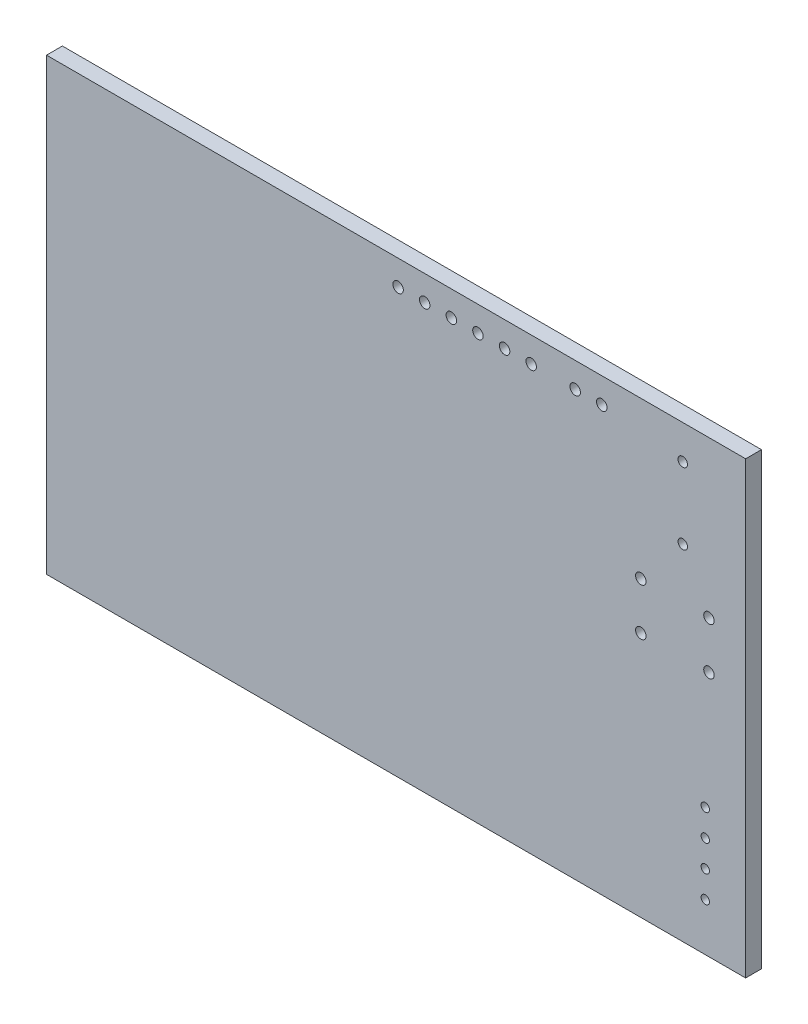
ISO-10303-21;
HEADER;
FILE_DESCRIPTION(('STEP AP214'),'2;1');
FILE_NAME('part.step','',(''),(''),'','','');
FILE_SCHEMA(('AUTOMOTIVE_DESIGN { 1 0 10303 214 1 1 1 1 }'));
ENDSEC;
DATA;
#1=APPLICATION_CONTEXT('core data for automotive mechanical design processes');
#2=APPLICATION_PROTOCOL_DEFINITION('international standard','automotive_design',2000,#1);
#3=PRODUCT_CONTEXT('',#1,'mechanical');
#4=PRODUCT('Part','Part','',(#3));
#5=PRODUCT_RELATED_PRODUCT_CATEGORY('part','',(#4));
#6=PRODUCT_DEFINITION_FORMATION('','',#4);
#7=PRODUCT_DEFINITION_CONTEXT('part definition',#1,'design');
#8=PRODUCT_DEFINITION('design','',#6,#7);
#9=PRODUCT_DEFINITION_SHAPE('','',#8);
#10=(LENGTH_UNIT() NAMED_UNIT(*) SI_UNIT(.MILLI.,.METRE.));
#11=(NAMED_UNIT(*) PLANE_ANGLE_UNIT() SI_UNIT($,.RADIAN.));
#12=(NAMED_UNIT(*) SI_UNIT($,.STERADIAN.) SOLID_ANGLE_UNIT());
#13=UNCERTAINTY_MEASURE_WITH_UNIT(LENGTH_MEASURE(1.E-05),#10,'distance_accuracy_value','');
#14=(GEOMETRIC_REPRESENTATION_CONTEXT(3) GLOBAL_UNCERTAINTY_ASSIGNED_CONTEXT((#13)) GLOBAL_UNIT_ASSIGNED_CONTEXT((#10,
#11,#12)) REPRESENTATION_CONTEXT('',''));
#15=CARTESIAN_POINT('',(0.,0.,0.));
#16=DIRECTION('',(0.,0.,1.));
#17=DIRECTION('',(1.,0.,0.));
#18=AXIS2_PLACEMENT_3D('',#15,#16,#17);
#19=CARTESIAN_POINT('',(27.35,18.2,-0.046));
#20=DIRECTION('',(0.,0.,-1.));
#21=DIRECTION('',(0.,-1.,0.));
#22=AXIS2_PLACEMENT_3D('',#19,#20,#21);
#23=CYLINDRICAL_SURFACE('',#22,0.45);
#24=CARTESIAN_POINT('',(27.35,18.2,1.510198));
#25=DIRECTION('',(0.,0.,-1.));
#26=DIRECTION('',(0.,-1.,0.));
#27=AXIS2_PLACEMENT_3D('',#24,#25,#26);
#28=CIRCLE('',#27,0.45);
#29=CARTESIAN_POINT('',(27.35,17.75,1.510198));
#30=VERTEX_POINT('',#29);
#31=EDGE_CURVE('E10',#30,#30,#28,.T.);
#32=ORIENTED_EDGE('',*,*,#31,.F.);
#33=EDGE_LOOP('',(#32));
#34=FACE_BOUND('',#33,.T.);
#35=CARTESIAN_POINT('',(27.35,18.2,0.));
#36=DIRECTION('',(0.,0.,-1.));
#37=DIRECTION('',(0.,-1.,0.));
#38=AXIS2_PLACEMENT_3D('',#35,#36,#37);
#39=CIRCLE('',#38,0.45);
#40=CARTESIAN_POINT('',(27.35,17.75,0.));
#41=VERTEX_POINT('',#40);
#42=EDGE_CURVE('E167',#41,#41,#39,.T.);
#43=ORIENTED_EDGE('',*,*,#42,.T.);
#44=EDGE_LOOP('',(#43));
#45=FACE_BOUND('',#44,.T.);
#46=ADVANCED_FACE('F16',(#34,#45),#23,.F.);
#47=CARTESIAN_POINT('',(27.35,11.4,-0.046));
#48=DIRECTION('',(0.,0.,-1.));
#49=DIRECTION('',(0.,-1.,0.));
#50=AXIS2_PLACEMENT_3D('',#47,#48,#49);
#51=CYLINDRICAL_SURFACE('',#50,0.45);
#52=CARTESIAN_POINT('',(27.35,11.4,1.510198));
#53=DIRECTION('',(0.,0.,-1.));
#54=DIRECTION('',(0.,-1.,0.));
#55=AXIS2_PLACEMENT_3D('',#52,#53,#54);
#56=CIRCLE('',#55,0.45);
#57=CARTESIAN_POINT('',(27.35,10.95,1.510198));
#58=VERTEX_POINT('',#57);
#59=EDGE_CURVE('E19',#58,#58,#56,.T.);
#60=ORIENTED_EDGE('',*,*,#59,.F.);
#61=EDGE_LOOP('',(#60));
#62=FACE_BOUND('',#61,.T.);
#63=CARTESIAN_POINT('',(27.35,11.4,0.));
#64=DIRECTION('',(0.,0.,-1.));
#65=DIRECTION('',(0.,-1.,0.));
#66=AXIS2_PLACEMENT_3D('',#63,#64,#65);
#67=CIRCLE('',#66,0.45);
#68=CARTESIAN_POINT('',(27.35,10.95,0.));
#69=VERTEX_POINT('',#68);
#70=EDGE_CURVE('E171',#69,#69,#67,.T.);
#71=ORIENTED_EDGE('',*,*,#70,.T.);
#72=EDGE_LOOP('',(#71));
#73=FACE_BOUND('',#72,.T.);
#74=ADVANCED_FACE('F242',(#62,#73),#51,.F.);
#75=CARTESIAN_POINT('',(19.625,19.05,-0.046));
#76=DIRECTION('',(0.,0.,-1.));
#77=DIRECTION('',(0.,-1.,0.));
#78=AXIS2_PLACEMENT_3D('',#75,#76,#77);
#79=CYLINDRICAL_SURFACE('',#78,0.5);
#80=CARTESIAN_POINT('',(19.625,19.05,1.510198));
#81=DIRECTION('',(0.,0.,-1.));
#82=DIRECTION('',(0.,-1.,0.));
#83=AXIS2_PLACEMENT_3D('',#80,#81,#82);
#84=CIRCLE('',#83,0.5);
#85=CARTESIAN_POINT('',(19.625,18.55,1.510198));
#86=VERTEX_POINT('',#85);
#87=EDGE_CURVE('E125',#86,#86,#84,.T.);
#88=ORIENTED_EDGE('',*,*,#87,.F.);
#89=EDGE_LOOP('',(#88));
#90=FACE_BOUND('',#89,.T.);
#91=CARTESIAN_POINT('',(19.625,19.05,0.));
#92=DIRECTION('',(0.,0.,-1.));
#93=DIRECTION('',(0.,-1.,0.));
#94=AXIS2_PLACEMENT_3D('',#91,#92,#93);
#95=CIRCLE('',#94,0.5);
#96=CARTESIAN_POINT('',(19.625,18.55,0.));
#97=VERTEX_POINT('',#96);
#98=EDGE_CURVE('E166',#97,#97,#95,.T.);
#99=ORIENTED_EDGE('',*,*,#98,.T.);
#100=EDGE_LOOP('',(#99));
#101=FACE_BOUND('',#100,.T.);
#102=ADVANCED_FACE('F245',(#90,#101),#79,.F.);
#103=CARTESIAN_POINT('',(17.085,19.05,-0.046));
#104=DIRECTION('',(0.,0.,-1.));
#105=DIRECTION('',(0.,-1.,0.));
#106=AXIS2_PLACEMENT_3D('',#103,#104,#105);
#107=CYLINDRICAL_SURFACE('',#106,0.5);
#108=CARTESIAN_POINT('',(17.085,19.05,1.510198));
#109=DIRECTION('',(0.,0.,-1.));
#110=DIRECTION('',(0.,-1.,0.));
#111=AXIS2_PLACEMENT_3D('',#108,#109,#110);
#112=CIRCLE('',#111,0.5);
#113=CARTESIAN_POINT('',(17.085,18.55,1.510198));
#114=VERTEX_POINT('',#113);
#115=EDGE_CURVE('E122',#114,#114,#112,.T.);
#116=ORIENTED_EDGE('',*,*,#115,.F.);
#117=EDGE_LOOP('',(#116));
#118=FACE_BOUND('',#117,.T.);
#119=CARTESIAN_POINT('',(17.085,19.05,0.));
#120=DIRECTION('',(0.,0.,-1.));
#121=DIRECTION('',(0.,-1.,0.));
#122=AXIS2_PLACEMENT_3D('',#119,#120,#121);
#123=CIRCLE('',#122,0.5);
#124=CARTESIAN_POINT('',(17.085,18.55,0.));
#125=VERTEX_POINT('',#124);
#126=EDGE_CURVE('E161',#125,#125,#123,.T.);
#127=ORIENTED_EDGE('',*,*,#126,.T.);
#128=EDGE_LOOP('',(#127));
#129=FACE_BOUND('',#128,.T.);
#130=ADVANCED_FACE('F403',(#118,#129),#107,.F.);
#131=CARTESIAN_POINT('',(29.85,6.55,-0.046));
#132=DIRECTION('',(0.,0.,-1.));
#133=DIRECTION('',(0.,-1.,0.));
#134=AXIS2_PLACEMENT_3D('',#131,#132,#133);
#135=CYLINDRICAL_SURFACE('',#134,0.5);
#136=CARTESIAN_POINT('',(29.85,6.55,1.510198));
#137=DIRECTION('',(0.,0.,-1.));
#138=DIRECTION('',(0.,-1.,0.));
#139=AXIS2_PLACEMENT_3D('',#136,#137,#138);
#140=CIRCLE('',#139,0.5);
#141=CARTESIAN_POINT('',(29.85,6.05,1.510198));
#142=VERTEX_POINT('',#141);
#143=EDGE_CURVE('E126',#142,#142,#140,.T.);
#144=ORIENTED_EDGE('',*,*,#143,.F.);
#145=EDGE_LOOP('',(#144));
#146=FACE_BOUND('',#145,.T.);
#147=CARTESIAN_POINT('',(29.85,6.55,0.));
#148=DIRECTION('',(0.,0.,-1.));
#149=DIRECTION('',(0.,-1.,0.));
#150=AXIS2_PLACEMENT_3D('',#147,#148,#149);
#151=CIRCLE('',#150,0.5);
#152=CARTESIAN_POINT('',(29.85,6.05,0.));
#153=VERTEX_POINT('',#152);
#154=EDGE_CURVE('E158',#153,#153,#151,.T.);
#155=ORIENTED_EDGE('',*,*,#154,.T.);
#156=EDGE_LOOP('',(#155));
#157=FACE_BOUND('',#156,.T.);
#158=ADVANCED_FACE('F399',(#146,#157),#135,.F.);
#159=CARTESIAN_POINT('',(23.35,6.55,-0.046));
#160=DIRECTION('',(0.,0.,-1.));
#161=DIRECTION('',(0.,-1.,0.));
#162=AXIS2_PLACEMENT_3D('',#159,#160,#161);
#163=CYLINDRICAL_SURFACE('',#162,0.5);
#164=CARTESIAN_POINT('',(23.35,6.55,1.510198));
#165=DIRECTION('',(0.,0.,-1.));
#166=DIRECTION('',(0.,-1.,0.));
#167=AXIS2_PLACEMENT_3D('',#164,#165,#166);
#168=CIRCLE('',#167,0.5);
#169=CARTESIAN_POINT('',(23.35,6.05,1.510198));
#170=VERTEX_POINT('',#169);
#171=EDGE_CURVE('E186',#170,#170,#168,.T.);
#172=ORIENTED_EDGE('',*,*,#171,.F.);
#173=EDGE_LOOP('',(#172));
#174=FACE_BOUND('',#173,.T.);
#175=CARTESIAN_POINT('',(23.35,6.55,0.));
#176=DIRECTION('',(0.,0.,-1.));
#177=DIRECTION('',(0.,-1.,0.));
#178=AXIS2_PLACEMENT_3D('',#175,#176,#177);
#179=CIRCLE('',#178,0.5);
#180=CARTESIAN_POINT('',(23.35,6.05,0.));
#181=VERTEX_POINT('',#180);
#182=EDGE_CURVE('E118',#181,#181,#179,.T.);
#183=ORIENTED_EDGE('',*,*,#182,.T.);
#184=EDGE_LOOP('',(#183));
#185=FACE_BOUND('',#184,.T.);
#186=ADVANCED_FACE('F331',(#174,#185),#163,.F.);
#187=CARTESIAN_POINT('',(29.85,2.05,-0.046));
#188=DIRECTION('',(0.,0.,-1.));
#189=DIRECTION('',(0.,-1.,0.));
#190=AXIS2_PLACEMENT_3D('',#187,#188,#189);
#191=CYLINDRICAL_SURFACE('',#190,0.5);
#192=CARTESIAN_POINT('',(29.85,2.05,1.510198));
#193=DIRECTION('',(0.,0.,-1.));
#194=DIRECTION('',(0.,-1.,0.));
#195=AXIS2_PLACEMENT_3D('',#192,#193,#194);
#196=CIRCLE('',#195,0.5);
#197=CARTESIAN_POINT('',(29.85,1.55,1.510198));
#198=VERTEX_POINT('',#197);
#199=EDGE_CURVE('E224',#198,#198,#196,.T.);
#200=ORIENTED_EDGE('',*,*,#199,.F.);
#201=EDGE_LOOP('',(#200));
#202=FACE_BOUND('',#201,.T.);
#203=CARTESIAN_POINT('',(29.85,2.05,0.));
#204=DIRECTION('',(0.,0.,-1.));
#205=DIRECTION('',(0.,-1.,0.));
#206=AXIS2_PLACEMENT_3D('',#203,#204,#205);
#207=CIRCLE('',#206,0.5);
#208=CARTESIAN_POINT('',(29.85,1.55,0.));
#209=VERTEX_POINT('',#208);
#210=EDGE_CURVE('E114',#209,#209,#207,.T.);
#211=ORIENTED_EDGE('',*,*,#210,.T.);
#212=EDGE_LOOP('',(#211));
#213=FACE_BOUND('',#212,.T.);
#214=ADVANCED_FACE('F328',(#202,#213),#191,.F.);
#215=CARTESIAN_POINT('',(23.35,2.05,-0.046));
#216=DIRECTION('',(0.,0.,-1.));
#217=DIRECTION('',(0.,-1.,0.));
#218=AXIS2_PLACEMENT_3D('',#215,#216,#217);
#219=CYLINDRICAL_SURFACE('',#218,0.5);
#220=CARTESIAN_POINT('',(23.35,2.05,1.510198));
#221=DIRECTION('',(0.,0.,-1.));
#222=DIRECTION('',(0.,-1.,0.));
#223=AXIS2_PLACEMENT_3D('',#220,#221,#222);
#224=CIRCLE('',#223,0.5);
#225=CARTESIAN_POINT('',(23.35,1.55,1.510198));
#226=VERTEX_POINT('',#225);
#227=EDGE_CURVE('E220',#226,#226,#224,.T.);
#228=ORIENTED_EDGE('',*,*,#227,.F.);
#229=EDGE_LOOP('',(#228));
#230=FACE_BOUND('',#229,.T.);
#231=CARTESIAN_POINT('',(23.35,2.05,0.));
#232=DIRECTION('',(0.,0.,-1.));
#233=DIRECTION('',(0.,-1.,0.));
#234=AXIS2_PLACEMENT_3D('',#231,#232,#233);
#235=CIRCLE('',#234,0.5);
#236=CARTESIAN_POINT('',(23.35,1.55,0.));
#237=VERTEX_POINT('',#236);
#238=EDGE_CURVE('E119',#237,#237,#235,.T.);
#239=ORIENTED_EDGE('',*,*,#238,.T.);
#240=EDGE_LOOP('',(#239));
#241=FACE_BOUND('',#240,.T.);
#242=ADVANCED_FACE('F330',(#230,#241),#219,.F.);
#243=CARTESIAN_POINT('',(12.89,19.05,-0.046));
#244=DIRECTION('',(0.,0.,-1.));
#245=DIRECTION('',(0.,-1.,0.));
#246=AXIS2_PLACEMENT_3D('',#243,#244,#245);
#247=CYLINDRICAL_SURFACE('',#246,0.5);
#248=CARTESIAN_POINT('',(12.89,19.05,1.510198));
#249=DIRECTION('',(0.,0.,-1.));
#250=DIRECTION('',(0.,-1.,0.));
#251=AXIS2_PLACEMENT_3D('',#248,#249,#250);
#252=CIRCLE('',#251,0.5);
#253=CARTESIAN_POINT('',(12.89,18.55,1.510198));
#254=VERTEX_POINT('',#253);
#255=EDGE_CURVE('E216',#254,#254,#252,.T.);
#256=ORIENTED_EDGE('',*,*,#255,.F.);
#257=EDGE_LOOP('',(#256));
#258=FACE_BOUND('',#257,.T.);
#259=CARTESIAN_POINT('',(12.89,19.05,0.));
#260=DIRECTION('',(0.,0.,-1.));
#261=DIRECTION('',(0.,-1.,0.));
#262=AXIS2_PLACEMENT_3D('',#259,#260,#261);
#263=CIRCLE('',#262,0.5);
#264=CARTESIAN_POINT('',(12.89,18.55,0.));
#265=VERTEX_POINT('',#264);
#266=EDGE_CURVE('E154',#265,#265,#263,.T.);
#267=ORIENTED_EDGE('',*,*,#266,.T.);
#268=EDGE_LOOP('',(#267));
#269=FACE_BOUND('',#268,.T.);
#270=ADVANCED_FACE('F345',(#258,#269),#247,.F.);
#271=CARTESIAN_POINT('',(10.35,19.05,-0.046));
#272=DIRECTION('',(0.,0.,-1.));
#273=DIRECTION('',(0.,-1.,0.));
#274=AXIS2_PLACEMENT_3D('',#271,#272,#273);
#275=CYLINDRICAL_SURFACE('',#274,0.5);
#276=CARTESIAN_POINT('',(10.35,19.05,1.510198));
#277=DIRECTION('',(0.,0.,-1.));
#278=DIRECTION('',(0.,-1.,0.));
#279=AXIS2_PLACEMENT_3D('',#276,#277,#278);
#280=CIRCLE('',#279,0.5);
#281=CARTESIAN_POINT('',(10.35,18.55,1.510198));
#282=VERTEX_POINT('',#281);
#283=EDGE_CURVE('E212',#282,#282,#280,.T.);
#284=ORIENTED_EDGE('',*,*,#283,.F.);
#285=EDGE_LOOP('',(#284));
#286=FACE_BOUND('',#285,.T.);
#287=CARTESIAN_POINT('',(10.35,19.05,0.));
#288=DIRECTION('',(0.,0.,-1.));
#289=DIRECTION('',(0.,-1.,0.));
#290=AXIS2_PLACEMENT_3D('',#287,#288,#289);
#291=CIRCLE('',#290,0.5);
#292=CARTESIAN_POINT('',(10.35,18.55,0.));
#293=VERTEX_POINT('',#292);
#294=EDGE_CURVE('E150',#293,#293,#291,.T.);
#295=ORIENTED_EDGE('',*,*,#294,.T.);
#296=EDGE_LOOP('',(#295));
#297=FACE_BOUND('',#296,.T.);
#298=ADVANCED_FACE('F336',(#286,#297),#275,.F.);
#299=CARTESIAN_POINT('',(7.81,19.05,-0.046));
#300=DIRECTION('',(0.,0.,-1.));
#301=DIRECTION('',(0.,-1.,0.));
#302=AXIS2_PLACEMENT_3D('',#299,#300,#301);
#303=CYLINDRICAL_SURFACE('',#302,0.5);
#304=CARTESIAN_POINT('',(7.81,19.05,1.510198));
#305=DIRECTION('',(0.,0.,-1.));
#306=DIRECTION('',(0.,-1.,0.));
#307=AXIS2_PLACEMENT_3D('',#304,#305,#306);
#308=CIRCLE('',#307,0.5);
#309=CARTESIAN_POINT('',(7.81,18.55,1.510198));
#310=VERTEX_POINT('',#309);
#311=EDGE_CURVE('E208',#310,#310,#308,.T.);
#312=ORIENTED_EDGE('',*,*,#311,.F.);
#313=EDGE_LOOP('',(#312));
#314=FACE_BOUND('',#313,.T.);
#315=CARTESIAN_POINT('',(7.81,19.05,0.));
#316=DIRECTION('',(0.,0.,-1.));
#317=DIRECTION('',(0.,-1.,0.));
#318=AXIS2_PLACEMENT_3D('',#315,#316,#317);
#319=CIRCLE('',#318,0.5);
#320=CARTESIAN_POINT('',(7.81,18.55,0.));
#321=VERTEX_POINT('',#320);
#322=EDGE_CURVE('E146',#321,#321,#319,.T.);
#323=ORIENTED_EDGE('',*,*,#322,.T.);
#324=EDGE_LOOP('',(#323));
#325=FACE_BOUND('',#324,.T.);
#326=ADVANCED_FACE('F333',(#314,#325),#303,.F.);
#327=CARTESIAN_POINT('',(5.27,19.05,-0.046));
#328=DIRECTION('',(0.,0.,-1.));
#329=DIRECTION('',(0.,-1.,0.));
#330=AXIS2_PLACEMENT_3D('',#327,#328,#329);
#331=CYLINDRICAL_SURFACE('',#330,0.5);
#332=CARTESIAN_POINT('',(5.27,19.05,1.510198));
#333=DIRECTION('',(0.,0.,-1.));
#334=DIRECTION('',(0.,-1.,0.));
#335=AXIS2_PLACEMENT_3D('',#332,#333,#334);
#336=CIRCLE('',#335,0.5);
#337=CARTESIAN_POINT('',(5.27,18.55,1.510198));
#338=VERTEX_POINT('',#337);
#339=EDGE_CURVE('E204',#338,#338,#336,.T.);
#340=ORIENTED_EDGE('',*,*,#339,.F.);
#341=EDGE_LOOP('',(#340));
#342=FACE_BOUND('',#341,.T.);
#343=CARTESIAN_POINT('',(5.27,19.05,0.));
#344=DIRECTION('',(0.,0.,-1.));
#345=DIRECTION('',(0.,-1.,0.));
#346=AXIS2_PLACEMENT_3D('',#343,#344,#345);
#347=CIRCLE('',#346,0.5);
#348=CARTESIAN_POINT('',(5.27,18.55,0.));
#349=VERTEX_POINT('',#348);
#350=EDGE_CURVE('E142',#349,#349,#347,.T.);
#351=ORIENTED_EDGE('',*,*,#350,.T.);
#352=EDGE_LOOP('',(#351));
#353=FACE_BOUND('',#352,.T.);
#354=ADVANCED_FACE('F335',(#342,#353),#331,.F.);
#355=CARTESIAN_POINT('',(2.73,19.05,-0.046));
#356=DIRECTION('',(0.,0.,-1.));
#357=DIRECTION('',(0.,-1.,0.));
#358=AXIS2_PLACEMENT_3D('',#355,#356,#357);
#359=CYLINDRICAL_SURFACE('',#358,0.5);
#360=CARTESIAN_POINT('',(2.73,19.05,1.510198));
#361=DIRECTION('',(0.,0.,-1.));
#362=DIRECTION('',(0.,-1.,0.));
#363=AXIS2_PLACEMENT_3D('',#360,#361,#362);
#364=CIRCLE('',#363,0.5);
#365=CARTESIAN_POINT('',(2.73,18.55,1.510198));
#366=VERTEX_POINT('',#365);
#367=EDGE_CURVE('E200',#366,#366,#364,.T.);
#368=ORIENTED_EDGE('',*,*,#367,.F.);
#369=EDGE_LOOP('',(#368));
#370=FACE_BOUND('',#369,.T.);
#371=CARTESIAN_POINT('',(2.73,19.05,0.));
#372=DIRECTION('',(0.,0.,-1.));
#373=DIRECTION('',(0.,-1.,0.));
#374=AXIS2_PLACEMENT_3D('',#371,#372,#373);
#375=CIRCLE('',#374,0.5);
#376=CARTESIAN_POINT('',(2.73,18.55,0.));
#377=VERTEX_POINT('',#376);
#378=EDGE_CURVE('E138',#377,#377,#375,.T.);
#379=ORIENTED_EDGE('',*,*,#378,.T.);
#380=EDGE_LOOP('',(#379));
#381=FACE_BOUND('',#380,.T.);
#382=ADVANCED_FACE('F342',(#370,#381),#359,.F.);
#383=CARTESIAN_POINT('',(0.19,19.05,-0.046));
#384=DIRECTION('',(0.,0.,-1.));
#385=DIRECTION('',(0.,-1.,0.));
#386=AXIS2_PLACEMENT_3D('',#383,#384,#385);
#387=CYLINDRICAL_SURFACE('',#386,0.5);
#388=CARTESIAN_POINT('',(0.19,19.05,1.510198));
#389=DIRECTION('',(0.,0.,-1.));
#390=DIRECTION('',(0.,-1.,0.));
#391=AXIS2_PLACEMENT_3D('',#388,#389,#390);
#392=CIRCLE('',#391,0.5);
#393=CARTESIAN_POINT('',(0.19,18.55,1.510198));
#394=VERTEX_POINT('',#393);
#395=EDGE_CURVE('E196',#394,#394,#392,.T.);
#396=ORIENTED_EDGE('',*,*,#395,.F.);
#397=EDGE_LOOP('',(#396));
#398=FACE_BOUND('',#397,.T.);
#399=CARTESIAN_POINT('',(0.19,19.05,0.));
#400=DIRECTION('',(0.,0.,-1.));
#401=DIRECTION('',(0.,-1.,0.));
#402=AXIS2_PLACEMENT_3D('',#399,#400,#401);
#403=CIRCLE('',#402,0.5);
#404=CARTESIAN_POINT('',(0.19,18.55,0.));
#405=VERTEX_POINT('',#404);
#406=EDGE_CURVE('E134',#405,#405,#403,.T.);
#407=ORIENTED_EDGE('',*,*,#406,.T.);
#408=EDGE_LOOP('',(#407));
#409=FACE_BOUND('',#408,.T.);
#410=ADVANCED_FACE('F483',(#398,#409),#387,.F.);
#411=CARTESIAN_POINT('',(29.5,-9.275,-0.046));
#412=DIRECTION('',(0.,0.,-1.));
#413=DIRECTION('',(0.,-1.,0.));
#414=AXIS2_PLACEMENT_3D('',#411,#412,#413);
#415=CYLINDRICAL_SURFACE('',#414,0.4);
#416=CARTESIAN_POINT('',(29.5,-9.275,1.510198));
#417=DIRECTION('',(0.,0.,-1.));
#418=DIRECTION('',(0.,-1.,0.));
#419=AXIS2_PLACEMENT_3D('',#416,#417,#418);
#420=CIRCLE('',#419,0.4);
#421=CARTESIAN_POINT('',(29.5,-9.675,1.510198));
#422=VERTEX_POINT('',#421);
#423=EDGE_CURVE('E192',#422,#422,#420,.T.);
#424=ORIENTED_EDGE('',*,*,#423,.F.);
#425=EDGE_LOOP('',(#424));
#426=FACE_BOUND('',#425,.T.);
#427=CARTESIAN_POINT('',(29.5,-9.275,0.));
#428=DIRECTION('',(0.,0.,-1.));
#429=DIRECTION('',(0.,-1.,0.));
#430=AXIS2_PLACEMENT_3D('',#427,#428,#429);
#431=CIRCLE('',#430,0.4);
#432=CARTESIAN_POINT('',(29.5,-9.675,0.));
#433=VERTEX_POINT('',#432);
#434=EDGE_CURVE('E108',#433,#433,#431,.T.);
#435=ORIENTED_EDGE('',*,*,#434,.T.);
#436=EDGE_LOOP('',(#435));
#437=FACE_BOUND('',#436,.T.);
#438=ADVANCED_FACE('F494',(#426,#437),#415,.F.);
#439=CARTESIAN_POINT('',(29.5,-11.815,-0.046));
#440=DIRECTION('',(0.,0.,-1.));
#441=DIRECTION('',(0.,-1.,0.));
#442=AXIS2_PLACEMENT_3D('',#439,#440,#441);
#443=CYLINDRICAL_SURFACE('',#442,0.4);
#444=CARTESIAN_POINT('',(29.5,-11.815,1.510198));
#445=DIRECTION('',(0.,0.,-1.));
#446=DIRECTION('',(0.,-1.,0.));
#447=AXIS2_PLACEMENT_3D('',#444,#445,#446);
#448=CIRCLE('',#447,0.4);
#449=CARTESIAN_POINT('',(29.5,-12.215,1.510198));
#450=VERTEX_POINT('',#449);
#451=EDGE_CURVE('E179',#450,#450,#448,.T.);
#452=ORIENTED_EDGE('',*,*,#451,.F.);
#453=EDGE_LOOP('',(#452));
#454=FACE_BOUND('',#453,.T.);
#455=CARTESIAN_POINT('',(29.5,-11.815,0.));
#456=DIRECTION('',(0.,0.,-1.));
#457=DIRECTION('',(0.,-1.,0.));
#458=AXIS2_PLACEMENT_3D('',#455,#456,#457);
#459=CIRCLE('',#458,0.4);
#460=CARTESIAN_POINT('',(29.5,-12.215,0.));
#461=VERTEX_POINT('',#460);
#462=EDGE_CURVE('E104',#461,#461,#459,.T.);
#463=ORIENTED_EDGE('',*,*,#462,.T.);
#464=EDGE_LOOP('',(#463));
#465=FACE_BOUND('',#464,.T.);
#466=ADVANCED_FACE('F299',(#454,#465),#443,.F.);
#467=CARTESIAN_POINT('',(29.5,-14.355,-0.046));
#468=DIRECTION('',(0.,0.,-1.));
#469=DIRECTION('',(0.,-1.,0.));
#470=AXIS2_PLACEMENT_3D('',#467,#468,#469);
#471=CYLINDRICAL_SURFACE('',#470,0.4);
#472=CARTESIAN_POINT('',(29.5,-14.355,1.510198));
#473=DIRECTION('',(0.,0.,-1.));
#474=DIRECTION('',(0.,-1.,0.));
#475=AXIS2_PLACEMENT_3D('',#472,#473,#474);
#476=CIRCLE('',#475,0.4);
#477=CARTESIAN_POINT('',(29.5,-14.755,1.510198));
#478=VERTEX_POINT('',#477);
#479=EDGE_CURVE('E175',#478,#478,#476,.T.);
#480=ORIENTED_EDGE('',*,*,#479,.F.);
#481=EDGE_LOOP('',(#480));
#482=FACE_BOUND('',#481,.T.);
#483=CARTESIAN_POINT('',(29.5,-14.355,0.));
#484=DIRECTION('',(0.,0.,-1.));
#485=DIRECTION('',(0.,-1.,0.));
#486=AXIS2_PLACEMENT_3D('',#483,#484,#485);
#487=CIRCLE('',#486,0.4);
#488=CARTESIAN_POINT('',(29.5,-14.755,0.));
#489=VERTEX_POINT('',#488);
#490=EDGE_CURVE('E109',#489,#489,#487,.T.);
#491=ORIENTED_EDGE('',*,*,#490,.T.);
#492=EDGE_LOOP('',(#491));
#493=FACE_BOUND('',#492,.T.);
#494=ADVANCED_FACE('F290',(#482,#493),#471,.F.);
#495=CARTESIAN_POINT('',(29.5,-16.895,-0.046));
#496=DIRECTION('',(0.,0.,-1.));
#497=DIRECTION('',(0.,-1.,0.));
#498=AXIS2_PLACEMENT_3D('',#495,#496,#497);
#499=CYLINDRICAL_SURFACE('',#498,0.4);
#500=CARTESIAN_POINT('',(29.5,-16.895,1.510198));
#501=DIRECTION('',(0.,0.,-1.));
#502=DIRECTION('',(0.,-1.,0.));
#503=AXIS2_PLACEMENT_3D('',#500,#501,#502);
#504=CIRCLE('',#503,0.4);
#505=CARTESIAN_POINT('',(29.5,-17.295,1.510198));
#506=VERTEX_POINT('',#505);
#507=EDGE_CURVE('E103',#506,#506,#504,.T.);
#508=ORIENTED_EDGE('',*,*,#507,.F.);
#509=EDGE_LOOP('',(#508));
#510=FACE_BOUND('',#509,.T.);
#511=CARTESIAN_POINT('',(29.5,-16.895,0.));
#512=DIRECTION('',(0.,0.,-1.));
#513=DIRECTION('',(0.,-1.,0.));
#514=AXIS2_PLACEMENT_3D('',#511,#512,#513);
#515=CIRCLE('',#514,0.4);
#516=CARTESIAN_POINT('',(29.5,-17.295,0.));
#517=VERTEX_POINT('',#516);
#518=EDGE_CURVE('E77',#517,#517,#515,.T.);
#519=ORIENTED_EDGE('',*,*,#518,.T.);
#520=EDGE_LOOP('',(#519));
#521=FACE_BOUND('',#520,.T.);
#522=ADVANCED_FACE('F288',(#510,#521),#499,.F.);
#523=CARTESIAN_POINT('',(-33.35,21.45,0.));
#524=DIRECTION('',(0.,1.,0.));
#525=DIRECTION('',(1.,0.,0.));
#526=AXIS2_PLACEMENT_3D('',#523,#524,#525);
#527=PLANE('',#526);
#528=DIRECTION('',(0.,0.,1.));
#529=VECTOR('',#528,1.);
#530=CARTESIAN_POINT('',(-33.35,21.45,0.));
#531=LINE('',#530,#529);
#532=CARTESIAN_POINT('',(-33.35,21.45,0.));
#533=VERTEX_POINT('',#532);
#534=CARTESIAN_POINT('',(-33.35,21.45,1.510198));
#535=VERTEX_POINT('',#534);
#536=EDGE_CURVE('E113',#533,#535,#531,.T.);
#537=ORIENTED_EDGE('',*,*,#536,.T.);
#538=DIRECTION('',(1.,0.,0.));
#539=VECTOR('',#538,1.);
#540=CARTESIAN_POINT('',(-33.35,21.45,1.510198));
#541=LINE('',#540,#539);
#542=CARTESIAN_POINT('',(33.35,21.45,1.510198));
#543=VERTEX_POINT('',#542);
#544=EDGE_CURVE('E50',#535,#543,#541,.T.);
#545=ORIENTED_EDGE('',*,*,#544,.T.);
#546=DIRECTION('',(0.,0.,1.));
#547=VECTOR('',#546,1.);
#548=CARTESIAN_POINT('',(33.35,21.45,0.));
#549=LINE('',#548,#547);
#550=CARTESIAN_POINT('',(33.35,21.45,0.));
#551=VERTEX_POINT('',#550);
#552=EDGE_CURVE('E83',#551,#543,#549,.T.);
#553=ORIENTED_EDGE('',*,*,#552,.F.);
#554=DIRECTION('',(1.,0.,0.));
#555=VECTOR('',#554,1.);
#556=CARTESIAN_POINT('',(-33.35,21.45,0.));
#557=LINE('',#556,#555);
#558=EDGE_CURVE('E37',#533,#551,#557,.T.);
#559=ORIENTED_EDGE('',*,*,#558,.F.);
#560=EDGE_LOOP('',(#537,#545,#553,#559));
#561=FACE_BOUND('',#560,.T.);
#562=ADVANCED_FACE('F90',(#561),#527,.T.);
#563=CARTESIAN_POINT('',(0.,0.,1.510198));
#564=DIRECTION('',(0.,0.,1.));
#565=DIRECTION('',(1.,0.,0.));
#566=AXIS2_PLACEMENT_3D('',#563,#564,#565);
#567=PLANE('',#566);
#568=ORIENTED_EDGE('',*,*,#31,.T.);
#569=EDGE_LOOP('',(#568));
#570=FACE_BOUND('',#569,.T.);
#571=ORIENTED_EDGE('',*,*,#59,.T.);
#572=EDGE_LOOP('',(#571));
#573=FACE_BOUND('',#572,.T.);
#574=ORIENTED_EDGE('',*,*,#87,.T.);
#575=EDGE_LOOP('',(#574));
#576=FACE_BOUND('',#575,.T.);
#577=ORIENTED_EDGE('',*,*,#115,.T.);
#578=EDGE_LOOP('',(#577));
#579=FACE_BOUND('',#578,.T.);
#580=ORIENTED_EDGE('',*,*,#143,.T.);
#581=EDGE_LOOP('',(#580));
#582=FACE_BOUND('',#581,.T.);
#583=ORIENTED_EDGE('',*,*,#171,.T.);
#584=EDGE_LOOP('',(#583));
#585=FACE_BOUND('',#584,.T.);
#586=ORIENTED_EDGE('',*,*,#199,.T.);
#587=EDGE_LOOP('',(#586));
#588=FACE_BOUND('',#587,.T.);
#589=ORIENTED_EDGE('',*,*,#227,.T.);
#590=EDGE_LOOP('',(#589));
#591=FACE_BOUND('',#590,.T.);
#592=ORIENTED_EDGE('',*,*,#255,.T.);
#593=EDGE_LOOP('',(#592));
#594=FACE_BOUND('',#593,.T.);
#595=ORIENTED_EDGE('',*,*,#283,.T.);
#596=EDGE_LOOP('',(#595));
#597=FACE_BOUND('',#596,.T.);
#598=ORIENTED_EDGE('',*,*,#311,.T.);
#599=EDGE_LOOP('',(#598));
#600=FACE_BOUND('',#599,.T.);
#601=ORIENTED_EDGE('',*,*,#339,.T.);
#602=EDGE_LOOP('',(#601));
#603=FACE_BOUND('',#602,.T.);
#604=ORIENTED_EDGE('',*,*,#367,.T.);
#605=EDGE_LOOP('',(#604));
#606=FACE_BOUND('',#605,.T.);
#607=ORIENTED_EDGE('',*,*,#395,.T.);
#608=EDGE_LOOP('',(#607));
#609=FACE_BOUND('',#608,.T.);
#610=ORIENTED_EDGE('',*,*,#423,.T.);
#611=EDGE_LOOP('',(#610));
#612=FACE_BOUND('',#611,.T.);
#613=ORIENTED_EDGE('',*,*,#451,.T.);
#614=EDGE_LOOP('',(#613));
#615=FACE_BOUND('',#614,.T.);
#616=ORIENTED_EDGE('',*,*,#479,.T.);
#617=EDGE_LOOP('',(#616));
#618=FACE_BOUND('',#617,.T.);
#619=ORIENTED_EDGE('',*,*,#507,.T.);
#620=EDGE_LOOP('',(#619));
#621=FACE_BOUND('',#620,.T.);
#622=DIRECTION('',(-1.,0.,0.));
#623=VECTOR('',#622,1.);
#624=CARTESIAN_POINT('',(33.35,-21.45,1.510198));
#625=LINE('',#624,#623);
#626=CARTESIAN_POINT('',(33.35,-21.45,1.510198));
#627=VERTEX_POINT('',#626);
#628=CARTESIAN_POINT('',(-33.35,-21.45,1.510198));
#629=VERTEX_POINT('',#628);
#630=EDGE_CURVE('E367',#627,#629,#625,.T.);
#631=ORIENTED_EDGE('',*,*,#630,.F.);
#632=DIRECTION('',(0.,-1.,0.));
#633=VECTOR('',#632,1.);
#634=CARTESIAN_POINT('',(33.35,21.45,1.510198));
#635=LINE('',#634,#633);
#636=EDGE_CURVE('E88',#543,#627,#635,.T.);
#637=ORIENTED_EDGE('',*,*,#636,.F.);
#638=ORIENTED_EDGE('',*,*,#544,.F.);
#639=DIRECTION('',(0.,1.,0.));
#640=VECTOR('',#639,1.);
#641=CARTESIAN_POINT('',(-33.35,-21.45,1.510198));
#642=LINE('',#641,#640);
#643=EDGE_CURVE('E87',#629,#535,#642,.T.);
#644=ORIENTED_EDGE('',*,*,#643,.F.);
#645=EDGE_LOOP('',(#631,#637,#638,#644));
#646=FACE_BOUND('',#645,.T.);
#647=ADVANCED_FACE('F240',(#570,#573,#576,#579,#582,#585,#588,#591,#594,#597,#600,#603,#606,
#609,#612,#615,#618,#621,#646),#567,.T.);
#648=CARTESIAN_POINT('',(0.,0.,0.));
#649=DIRECTION('',(0.,0.,1.));
#650=DIRECTION('',(1.,0.,0.));
#651=AXIS2_PLACEMENT_3D('',#648,#649,#650);
#652=PLANE('',#651);
#653=ORIENTED_EDGE('',*,*,#42,.F.);
#654=EDGE_LOOP('',(#653));
#655=FACE_BOUND('',#654,.T.);
#656=ORIENTED_EDGE('',*,*,#70,.F.);
#657=EDGE_LOOP('',(#656));
#658=FACE_BOUND('',#657,.T.);
#659=ORIENTED_EDGE('',*,*,#98,.F.);
#660=EDGE_LOOP('',(#659));
#661=FACE_BOUND('',#660,.T.);
#662=ORIENTED_EDGE('',*,*,#126,.F.);
#663=EDGE_LOOP('',(#662));
#664=FACE_BOUND('',#663,.T.);
#665=ORIENTED_EDGE('',*,*,#154,.F.);
#666=EDGE_LOOP('',(#665));
#667=FACE_BOUND('',#666,.T.);
#668=ORIENTED_EDGE('',*,*,#182,.F.);
#669=EDGE_LOOP('',(#668));
#670=FACE_BOUND('',#669,.T.);
#671=ORIENTED_EDGE('',*,*,#210,.F.);
#672=EDGE_LOOP('',(#671));
#673=FACE_BOUND('',#672,.T.);
#674=ORIENTED_EDGE('',*,*,#238,.F.);
#675=EDGE_LOOP('',(#674));
#676=FACE_BOUND('',#675,.T.);
#677=ORIENTED_EDGE('',*,*,#266,.F.);
#678=EDGE_LOOP('',(#677));
#679=FACE_BOUND('',#678,.T.);
#680=ORIENTED_EDGE('',*,*,#294,.F.);
#681=EDGE_LOOP('',(#680));
#682=FACE_BOUND('',#681,.T.);
#683=ORIENTED_EDGE('',*,*,#322,.F.);
#684=EDGE_LOOP('',(#683));
#685=FACE_BOUND('',#684,.T.);
#686=ORIENTED_EDGE('',*,*,#350,.F.);
#687=EDGE_LOOP('',(#686));
#688=FACE_BOUND('',#687,.T.);
#689=ORIENTED_EDGE('',*,*,#378,.F.);
#690=EDGE_LOOP('',(#689));
#691=FACE_BOUND('',#690,.T.);
#692=ORIENTED_EDGE('',*,*,#406,.F.);
#693=EDGE_LOOP('',(#692));
#694=FACE_BOUND('',#693,.T.);
#695=ORIENTED_EDGE('',*,*,#434,.F.);
#696=EDGE_LOOP('',(#695));
#697=FACE_BOUND('',#696,.T.);
#698=ORIENTED_EDGE('',*,*,#462,.F.);
#699=EDGE_LOOP('',(#698));
#700=FACE_BOUND('',#699,.T.);
#701=ORIENTED_EDGE('',*,*,#490,.F.);
#702=EDGE_LOOP('',(#701));
#703=FACE_BOUND('',#702,.T.);
#704=ORIENTED_EDGE('',*,*,#518,.F.);
#705=EDGE_LOOP('',(#704));
#706=FACE_BOUND('',#705,.T.);
#707=DIRECTION('',(0.,1.,0.));
#708=VECTOR('',#707,1.);
#709=CARTESIAN_POINT('',(-33.35,-21.45,0.));
#710=LINE('',#709,#708);
#711=CARTESIAN_POINT('',(-33.35,-21.45,0.));
#712=VERTEX_POINT('',#711);
#713=EDGE_CURVE('E74',#712,#533,#710,.T.);
#714=ORIENTED_EDGE('',*,*,#713,.T.);
#715=ORIENTED_EDGE('',*,*,#558,.T.);
#716=DIRECTION('',(0.,-1.,0.));
#717=VECTOR('',#716,1.);
#718=CARTESIAN_POINT('',(33.35,21.45,0.));
#719=LINE('',#718,#717);
#720=CARTESIAN_POINT('',(33.35,-21.45,0.));
#721=VERTEX_POINT('',#720);
#722=EDGE_CURVE('E72',#551,#721,#719,.T.);
#723=ORIENTED_EDGE('',*,*,#722,.T.);
#724=DIRECTION('',(-1.,0.,0.));
#725=VECTOR('',#724,1.);
#726=CARTESIAN_POINT('',(33.35,-21.45,0.));
#727=LINE('',#726,#725);
#728=EDGE_CURVE('E92',#721,#712,#727,.T.);
#729=ORIENTED_EDGE('',*,*,#728,.T.);
#730=EDGE_LOOP('',(#714,#715,#723,#729));
#731=FACE_BOUND('',#730,.T.);
#732=ADVANCED_FACE('F70',(#655,#658,#661,#664,#667,#670,#673,#676,#679,#682,#685,#688,#691,#694,
#697,#700,#703,#706,#731),#652,.F.);
#733=CARTESIAN_POINT('',(-33.35,-21.45,0.));
#734=DIRECTION('',(-1.,0.,0.));
#735=DIRECTION('',(0.,0.,1.));
#736=AXIS2_PLACEMENT_3D('',#733,#734,#735);
#737=PLANE('',#736);
#738=DIRECTION('',(0.,0.,1.));
#739=VECTOR('',#738,1.);
#740=CARTESIAN_POINT('',(-33.35,-21.45,0.));
#741=LINE('',#740,#739);
#742=EDGE_CURVE('E99',#712,#629,#741,.T.);
#743=ORIENTED_EDGE('',*,*,#742,.T.);
#744=ORIENTED_EDGE('',*,*,#643,.T.);
#745=ORIENTED_EDGE('',*,*,#536,.F.);
#746=ORIENTED_EDGE('',*,*,#713,.F.);
#747=EDGE_LOOP('',(#743,#744,#745,#746));
#748=FACE_BOUND('',#747,.T.);
#749=ADVANCED_FACE('F250',(#748),#737,.T.);
#750=CARTESIAN_POINT('',(33.35,21.45,0.));
#751=DIRECTION('',(1.,0.,0.));
#752=DIRECTION('',(0.,1.,0.));
#753=AXIS2_PLACEMENT_3D('',#750,#751,#752);
#754=PLANE('',#753);
#755=ORIENTED_EDGE('',*,*,#552,.T.);
#756=ORIENTED_EDGE('',*,*,#636,.T.);
#757=DIRECTION('',(0.,0.,1.));
#758=VECTOR('',#757,1.);
#759=CARTESIAN_POINT('',(33.35,-21.45,0.));
#760=LINE('',#759,#758);
#761=EDGE_CURVE('E85',#721,#627,#760,.T.);
#762=ORIENTED_EDGE('',*,*,#761,.F.);
#763=ORIENTED_EDGE('',*,*,#722,.F.);
#764=EDGE_LOOP('',(#755,#756,#762,#763));
#765=FACE_BOUND('',#764,.T.);
#766=ADVANCED_FACE('F82',(#765),#754,.T.);
#767=CARTESIAN_POINT('',(33.35,-21.45,0.));
#768=DIRECTION('',(0.,-1.,0.));
#769=DIRECTION('',(0.,0.,-1.));
#770=AXIS2_PLACEMENT_3D('',#767,#768,#769);
#771=PLANE('',#770);
#772=ORIENTED_EDGE('',*,*,#761,.T.);
#773=ORIENTED_EDGE('',*,*,#630,.T.);
#774=ORIENTED_EDGE('',*,*,#742,.F.);
#775=ORIENTED_EDGE('',*,*,#728,.F.);
#776=EDGE_LOOP('',(#772,#773,#774,#775));
#777=FACE_BOUND('',#776,.T.);
#778=ADVANCED_FACE('F319',(#777),#771,.T.);
#779=CLOSED_SHELL('',(#46,#74,#102,#130,#158,#186,#214,#242,#270,#298,#326,#354,#382,#410,#438,
#466,#494,#522,#562,#647,#732,#749,#766,#778));
#780=MANIFOLD_SOLID_BREP('B1',#779);
#781=ADVANCED_BREP_SHAPE_REPRESENTATION('',(#18,#780),#14);
#782=SHAPE_DEFINITION_REPRESENTATION(#9,#781);
ENDSEC;
END-ISO-10303-21;
